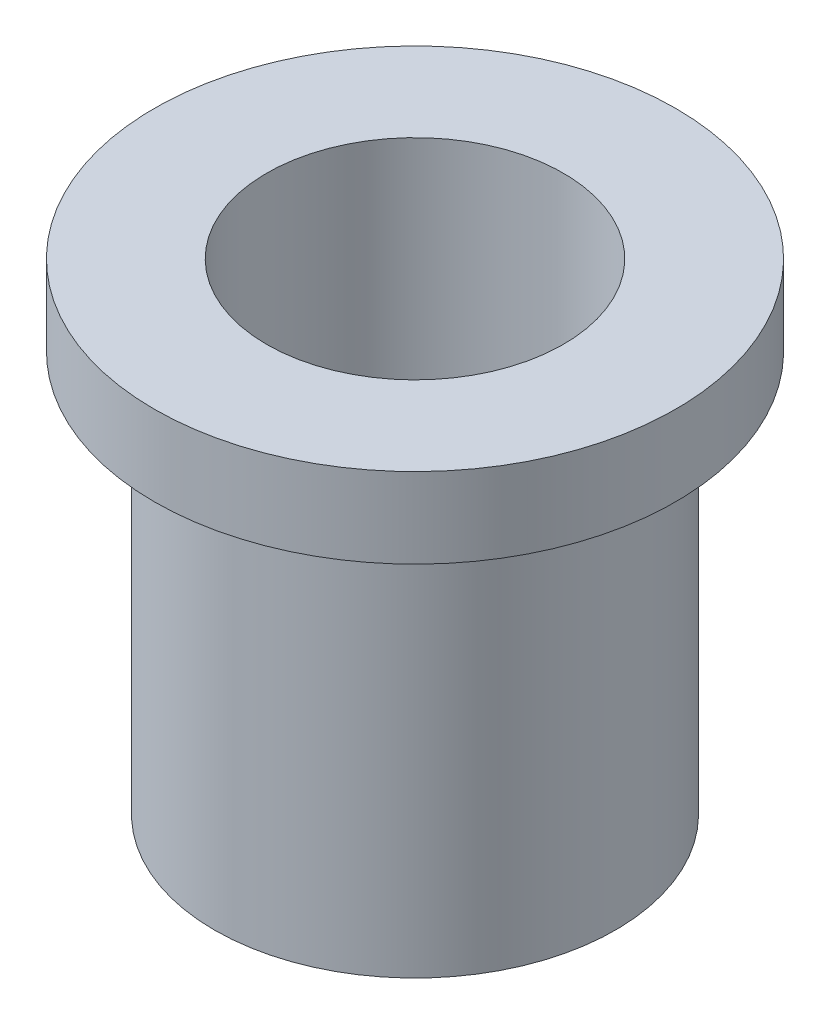
ISO-10303-21;
HEADER;
FILE_DESCRIPTION(('STEP AP214'),'2;1');
FILE_NAME('part.step','',(''),(''),'','','');
FILE_SCHEMA(('AUTOMOTIVE_DESIGN { 1 0 10303 214 1 1 1 1 }'));
ENDSEC;
DATA;
#1=APPLICATION_CONTEXT('core data for automotive mechanical design processes');
#2=APPLICATION_PROTOCOL_DEFINITION('international standard','automotive_design',2000,#1);
#3=PRODUCT_CONTEXT('',#1,'mechanical');
#4=PRODUCT('Part','Part','',(#3));
#5=PRODUCT_RELATED_PRODUCT_CATEGORY('part','',(#4));
#6=PRODUCT_DEFINITION_FORMATION('','',#4);
#7=PRODUCT_DEFINITION_CONTEXT('part definition',#1,'design');
#8=PRODUCT_DEFINITION('design','',#6,#7);
#9=PRODUCT_DEFINITION_SHAPE('','',#8);
#10=(LENGTH_UNIT() NAMED_UNIT(*) SI_UNIT(.MILLI.,.METRE.));
#11=(NAMED_UNIT(*) PLANE_ANGLE_UNIT() SI_UNIT($,.RADIAN.));
#12=(NAMED_UNIT(*) SI_UNIT($,.STERADIAN.) SOLID_ANGLE_UNIT());
#13=UNCERTAINTY_MEASURE_WITH_UNIT(LENGTH_MEASURE(1.E-05),#10,'distance_accuracy_value','');
#14=(GEOMETRIC_REPRESENTATION_CONTEXT(3) GLOBAL_UNCERTAINTY_ASSIGNED_CONTEXT((#13)) GLOBAL_UNIT_ASSIGNED_CONTEXT((#10,
#11,#12)) REPRESENTATION_CONTEXT('',''));
#15=CARTESIAN_POINT('',(0.,0.,0.));
#16=DIRECTION('',(0.,0.,1.));
#17=DIRECTION('',(1.,0.,0.));
#18=AXIS2_PLACEMENT_3D('',#15,#16,#17);
#19=CARTESIAN_POINT('',(0.,0.,0.));
#20=DIRECTION('',(0.,1.,0.));
#21=DIRECTION('',(0.,0.,1.));
#22=AXIS2_PLACEMENT_3D('',#19,#20,#21);
#23=PLANE('',#22);
#24=CARTESIAN_POINT('',(0.,0.,0.));
#25=DIRECTION('',(0.,1.,0.));
#26=DIRECTION('',(0.,0.,1.));
#27=AXIS2_PLACEMENT_3D('',#24,#25,#26);
#28=CIRCLE('',#27,3.175);
#29=CARTESIAN_POINT('',(0.,0.,3.175));
#30=VERTEX_POINT('',#29);
#31=EDGE_CURVE('E37',#30,#30,#28,.T.);
#32=ORIENTED_EDGE('',*,*,#31,.F.);
#33=EDGE_LOOP('',(#32));
#34=FACE_BOUND('',#33,.T.);
#35=CARTESIAN_POINT('',(0.,0.,0.));
#36=DIRECTION('',(0.,1.,0.));
#37=DIRECTION('',(0.,0.,1.));
#38=AXIS2_PLACEMENT_3D('',#35,#36,#37);
#39=CIRCLE('',#38,2.3495);
#40=CARTESIAN_POINT('',(0.,0.,2.3495));
#41=VERTEX_POINT('',#40);
#42=EDGE_CURVE('E44',#41,#41,#39,.T.);
#43=ORIENTED_EDGE('',*,*,#42,.T.);
#44=EDGE_LOOP('',(#43));
#45=FACE_BOUND('',#44,.T.);
#46=ADVANCED_FACE('F33',(#34,#45),#23,.F.);
#47=CARTESIAN_POINT('',(0.,6.35,0.));
#48=DIRECTION('',(0.,-1.,0.));
#49=DIRECTION('',(0.,0.,-1.));
#50=AXIS2_PLACEMENT_3D('',#47,#48,#49);
#51=CYLINDRICAL_SURFACE('',#50,3.175);
#52=CARTESIAN_POINT('',(0.,6.35,0.));
#53=DIRECTION('',(0.,1.,0.));
#54=DIRECTION('',(0.,0.,1.));
#55=AXIS2_PLACEMENT_3D('',#52,#53,#54);
#56=CIRCLE('',#55,3.175);
#57=CARTESIAN_POINT('',(0.,6.35,3.175));
#58=VERTEX_POINT('',#57);
#59=EDGE_CURVE('E10',#58,#58,#56,.T.);
#60=ORIENTED_EDGE('',*,*,#59,.F.);
#61=EDGE_LOOP('',(#60));
#62=FACE_BOUND('',#61,.T.);
#63=ORIENTED_EDGE('',*,*,#31,.T.);
#64=EDGE_LOOP('',(#63));
#65=FACE_BOUND('',#64,.T.);
#66=ADVANCED_FACE('F35',(#62,#65),#51,.T.);
#67=CARTESIAN_POINT('',(0.,6.35,0.));
#68=DIRECTION('',(0.,-1.,0.));
#69=DIRECTION('',(0.,0.,-1.));
#70=AXIS2_PLACEMENT_3D('',#67,#68,#69);
#71=CYLINDRICAL_SURFACE('',#70,2.3495);
#72=ORIENTED_EDGE('',*,*,#42,.F.);
#73=EDGE_LOOP('',(#72));
#74=FACE_BOUND('',#73,.T.);
#75=CARTESIAN_POINT('',(0.,7.62,0.));
#76=DIRECTION('',(0.,1.,0.));
#77=DIRECTION('',(0.,0.,1.));
#78=AXIS2_PLACEMENT_3D('',#75,#76,#77);
#79=CIRCLE('',#78,2.3495);
#80=CARTESIAN_POINT('',(0.,7.62,2.3495));
#81=VERTEX_POINT('',#80);
#82=EDGE_CURVE('E52',#81,#81,#79,.T.);
#83=ORIENTED_EDGE('',*,*,#82,.T.);
#84=EDGE_LOOP('',(#83));
#85=FACE_BOUND('',#84,.T.);
#86=ADVANCED_FACE('F58',(#74,#85),#71,.F.);
#87=CARTESIAN_POINT('',(0.,6.35,0.));
#88=DIRECTION('',(0.,1.,0.));
#89=DIRECTION('',(0.,0.,1.));
#90=AXIS2_PLACEMENT_3D('',#87,#88,#89);
#91=PLANE('',#90);
#92=CARTESIAN_POINT('',(0.,6.35,0.));
#93=DIRECTION('',(0.,1.,0.));
#94=DIRECTION('',(0.,0.,1.));
#95=AXIS2_PLACEMENT_3D('',#92,#93,#94);
#96=CIRCLE('',#95,4.1275);
#97=CARTESIAN_POINT('',(0.,6.35,4.1275));
#98=VERTEX_POINT('',#97);
#99=EDGE_CURVE('E49',#98,#98,#96,.T.);
#100=ORIENTED_EDGE('',*,*,#99,.F.);
#101=EDGE_LOOP('',(#100));
#102=FACE_BOUND('',#101,.T.);
#103=ORIENTED_EDGE('',*,*,#59,.T.);
#104=EDGE_LOOP('',(#103));
#105=FACE_BOUND('',#104,.T.);
#106=ADVANCED_FACE('F63',(#102,#105),#91,.F.);
#107=CARTESIAN_POINT('',(0.,7.62,0.));
#108=DIRECTION('',(0.,1.,0.));
#109=DIRECTION('',(0.,0.,1.));
#110=AXIS2_PLACEMENT_3D('',#107,#108,#109);
#111=PLANE('',#110);
#112=CARTESIAN_POINT('',(0.,7.62,0.));
#113=DIRECTION('',(0.,1.,0.));
#114=DIRECTION('',(0.,0.,1.));
#115=AXIS2_PLACEMENT_3D('',#112,#113,#114);
#116=CIRCLE('',#115,4.1275);
#117=CARTESIAN_POINT('',(0.,7.62,4.1275));
#118=VERTEX_POINT('',#117);
#119=EDGE_CURVE('E48',#118,#118,#116,.T.);
#120=ORIENTED_EDGE('',*,*,#119,.T.);
#121=EDGE_LOOP('',(#120));
#122=FACE_BOUND('',#121,.T.);
#123=ORIENTED_EDGE('',*,*,#82,.F.);
#124=EDGE_LOOP('',(#123));
#125=FACE_BOUND('',#124,.T.);
#126=ADVANCED_FACE('F60',(#122,#125),#111,.T.);
#127=CARTESIAN_POINT('',(0.,7.62,0.));
#128=DIRECTION('',(0.,-1.,0.));
#129=DIRECTION('',(0.,0.,-1.));
#130=AXIS2_PLACEMENT_3D('',#127,#128,#129);
#131=CYLINDRICAL_SURFACE('',#130,4.1275);
#132=ORIENTED_EDGE('',*,*,#119,.F.);
#133=EDGE_LOOP('',(#132));
#134=FACE_BOUND('',#133,.T.);
#135=ORIENTED_EDGE('',*,*,#99,.T.);
#136=EDGE_LOOP('',(#135));
#137=FACE_BOUND('',#136,.T.);
#138=ADVANCED_FACE('F62',(#134,#137),#131,.T.);
#139=CLOSED_SHELL('',(#46,#66,#86,#106,#126,#138));
#140=MANIFOLD_SOLID_BREP('B2',#139);
#141=ADVANCED_BREP_SHAPE_REPRESENTATION('',(#18,#140),#14);
#142=SHAPE_DEFINITION_REPRESENTATION(#9,#141);
ENDSEC;
END-ISO-10303-21;
